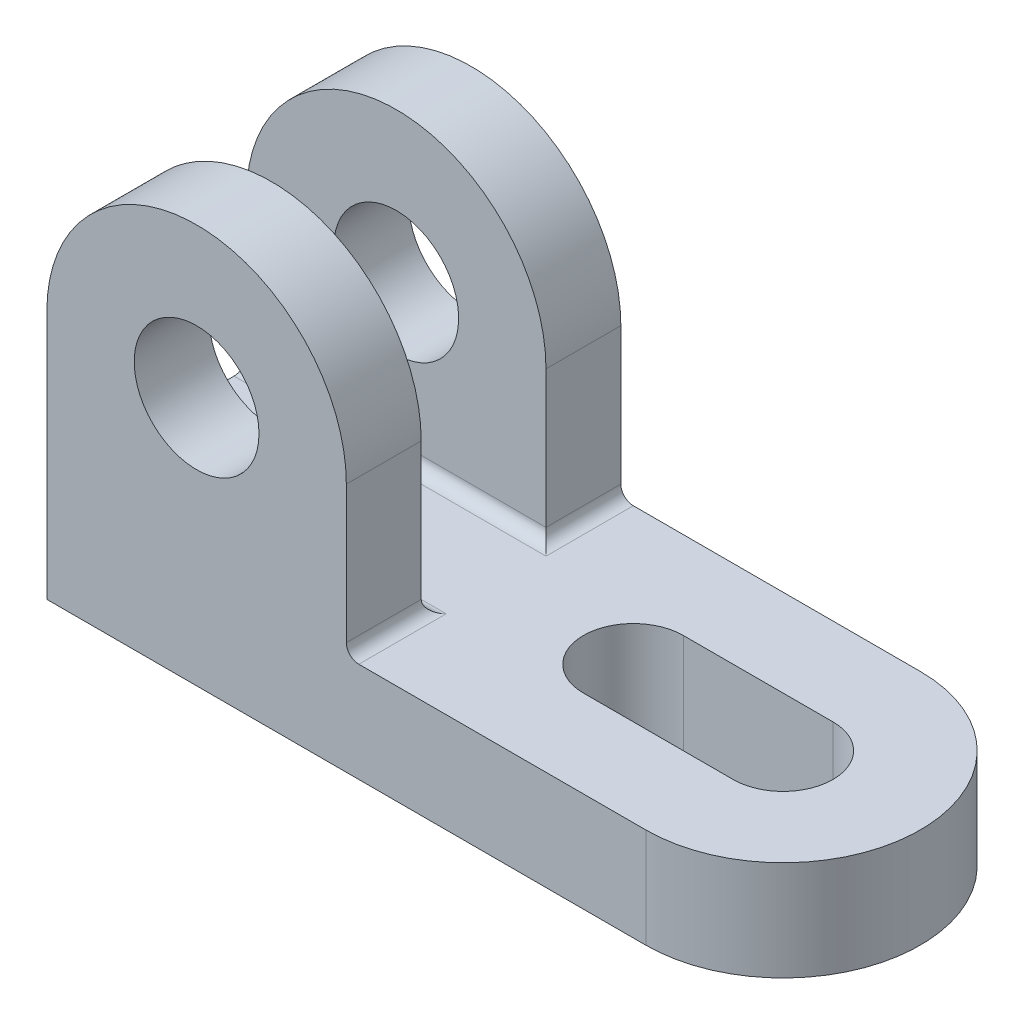
ISO-10303-21;
HEADER;
FILE_DESCRIPTION(('STEP AP214'),'2;1');
FILE_NAME('part.step','',(''),(''),'','','');
FILE_SCHEMA(('AUTOMOTIVE_DESIGN { 1 0 10303 214 1 1 1 1 }'));
ENDSEC;
DATA;
#1=APPLICATION_CONTEXT('core data for automotive mechanical design processes');
#2=APPLICATION_PROTOCOL_DEFINITION('international standard','automotive_design',2000,#1);
#3=PRODUCT_CONTEXT('',#1,'mechanical');
#4=PRODUCT('Part','Part','',(#3));
#5=PRODUCT_RELATED_PRODUCT_CATEGORY('part','',(#4));
#6=PRODUCT_DEFINITION_FORMATION('','',#4);
#7=PRODUCT_DEFINITION_CONTEXT('part definition',#1,'design');
#8=PRODUCT_DEFINITION('design','',#6,#7);
#9=PRODUCT_DEFINITION_SHAPE('','',#8);
#10=(LENGTH_UNIT() NAMED_UNIT(*) SI_UNIT(.MILLI.,.METRE.));
#11=(NAMED_UNIT(*) PLANE_ANGLE_UNIT() SI_UNIT($,.RADIAN.));
#12=(NAMED_UNIT(*) SI_UNIT($,.STERADIAN.) SOLID_ANGLE_UNIT());
#13=UNCERTAINTY_MEASURE_WITH_UNIT(LENGTH_MEASURE(1.E-05),#10,'distance_accuracy_value','');
#14=(GEOMETRIC_REPRESENTATION_CONTEXT(3) GLOBAL_UNCERTAINTY_ASSIGNED_CONTEXT((#13)) GLOBAL_UNIT_ASSIGNED_CONTEXT((#10,
#11,#12)) REPRESENTATION_CONTEXT('',''));
#15=CARTESIAN_POINT('',(0.,0.,0.));
#16=DIRECTION('',(0.,0.,1.));
#17=DIRECTION('',(1.,0.,0.));
#18=AXIS2_PLACEMENT_3D('',#15,#16,#17);
#19=CARTESIAN_POINT('',(0.,16.,0.));
#20=DIRECTION('',(0.,1.,0.));
#21=DIRECTION('',(0.,0.,1.));
#22=AXIS2_PLACEMENT_3D('',#19,#20,#21);
#23=PLANE('',#22);
#24=CARTESIAN_POINT('',(72.,16.,-22.));
#25=DIRECTION('',(0.,1.,0.));
#26=DIRECTION('',(0.,0.,1.));
#27=AXIS2_PLACEMENT_3D('',#24,#25,#26);
#28=CIRCLE('',#27,8.);
#29=CARTESIAN_POINT('',(72.,16.,-30.));
#30=VERTEX_POINT('',#29);
#31=CARTESIAN_POINT('',(72.,16.,-14.));
#32=VERTEX_POINT('',#31);
#33=EDGE_CURVE('E232',#30,#32,#28,.T.);
#34=ORIENTED_EDGE('',*,*,#33,.F.);
#35=DIRECTION('',(-1.,0.,0.));
#36=VECTOR('',#35,1.);
#37=CARTESIAN_POINT('',(72.,16.,-30.));
#38=LINE('',#37,#36);
#39=CARTESIAN_POINT('',(96.,16.,-30.));
#40=VERTEX_POINT('',#39);
#41=EDGE_CURVE('E244',#40,#30,#38,.T.);
#42=ORIENTED_EDGE('',*,*,#41,.F.);
#43=CARTESIAN_POINT('',(96.,16.,-22.));
#44=DIRECTION('',(0.,1.,0.));
#45=DIRECTION('',(0.,0.,1.));
#46=AXIS2_PLACEMENT_3D('',#43,#44,#45);
#47=CIRCLE('',#46,8.);
#48=CARTESIAN_POINT('',(96.,16.,-14.));
#49=VERTEX_POINT('',#48);
#50=EDGE_CURVE('E258',#49,#40,#47,.T.);
#51=ORIENTED_EDGE('',*,*,#50,.F.);
#52=DIRECTION('',(1.,0.,0.));
#53=VECTOR('',#52,1.);
#54=CARTESIAN_POINT('',(72.,16.,-14.));
#55=LINE('',#54,#53);
#56=EDGE_CURVE('E255',#32,#49,#55,.T.);
#57=ORIENTED_EDGE('',*,*,#56,.F.);
#58=EDGE_LOOP('',(#34,#42,#51,#57));
#59=FACE_BOUND('',#58,.T.);
#60=DIRECTION('',(-1.,0.,0.));
#61=VECTOR('',#60,1.);
#62=CARTESIAN_POINT('',(0.,16.,-44.));
#63=LINE('',#62,#61);
#64=CARTESIAN_POINT('',(96.,16.,-44.));
#65=VERTEX_POINT('',#64);
#66=CARTESIAN_POINT('',(50.,16.,-44.));
#67=VERTEX_POINT('',#66);
#68=EDGE_CURVE('E277',#65,#67,#63,.T.);
#69=ORIENTED_EDGE('',*,*,#68,.T.);
#70=DIRECTION('',(0.,0.,-1.));
#71=VECTOR('',#70,1.);
#72=CARTESIAN_POINT('',(50.,16.,0.));
#73=LINE('',#72,#71);
#74=CARTESIAN_POINT('',(50.,16.,-30.));
#75=VERTEX_POINT('',#74);
#76=EDGE_CURVE('E317',#67,#75,#73,.F.);
#77=ORIENTED_EDGE('',*,*,#76,.T.);
#78=DIRECTION('',(1.,0.,0.));
#79=VECTOR('',#78,1.);
#80=CARTESIAN_POINT('',(0.,16.,-30.));
#81=LINE('',#80,#79);
#82=CARTESIAN_POINT('',(0.,16.,-30.));
#83=VERTEX_POINT('',#82);
#84=EDGE_CURVE('E315',#75,#83,#81,.F.);
#85=ORIENTED_EDGE('',*,*,#84,.T.);
#86=DIRECTION('',(0.,0.,1.));
#87=VECTOR('',#86,1.);
#88=CARTESIAN_POINT('',(0.,16.,0.));
#89=LINE('',#88,#87);
#90=CARTESIAN_POINT('',(0.,16.,-14.));
#91=VERTEX_POINT('',#90);
#92=EDGE_CURVE('E280',#83,#91,#89,.T.);
#93=ORIENTED_EDGE('',*,*,#92,.T.);
#94=DIRECTION('',(1.,0.,0.));
#95=VECTOR('',#94,1.);
#96=CARTESIAN_POINT('',(0.,16.,-14.));
#97=LINE('',#96,#95);
#98=CARTESIAN_POINT('',(50.,16.,-14.));
#99=VERTEX_POINT('',#98);
#100=EDGE_CURVE('E312',#91,#99,#97,.T.);
#101=ORIENTED_EDGE('',*,*,#100,.T.);
#102=DIRECTION('',(0.,0.,1.));
#103=VECTOR('',#102,1.);
#104=CARTESIAN_POINT('',(50.,16.,0.));
#105=LINE('',#104,#103);
#106=CARTESIAN_POINT('',(50.,16.,0.));
#107=VERTEX_POINT('',#106);
#108=EDGE_CURVE('E310',#99,#107,#105,.T.);
#109=ORIENTED_EDGE('',*,*,#108,.T.);
#110=DIRECTION('',(1.,0.,0.));
#111=VECTOR('',#110,1.);
#112=CARTESIAN_POINT('',(0.,16.,0.));
#113=LINE('',#112,#111);
#114=CARTESIAN_POINT('',(96.,16.,0.));
#115=VERTEX_POINT('',#114);
#116=EDGE_CURVE('E272',#107,#115,#113,.T.);
#117=ORIENTED_EDGE('',*,*,#116,.T.);
#118=CARTESIAN_POINT('',(96.,16.,-22.));
#119=DIRECTION('',(0.,1.,0.));
#120=DIRECTION('',(0.,0.,1.));
#121=AXIS2_PLACEMENT_3D('',#118,#119,#120);
#122=CIRCLE('',#121,22.);
#123=EDGE_CURVE('E274',#115,#65,#122,.T.);
#124=ORIENTED_EDGE('',*,*,#123,.T.);
#125=EDGE_LOOP('',(#69,#77,#85,#93,#101,#109,#117,#124));
#126=FACE_BOUND('',#125,.T.);
#127=ADVANCED_FACE('F65',(#59,#126),#23,.T.);
#128=CARTESIAN_POINT('',(0.,16.,0.));
#129=DIRECTION('',(0.,0.,-1.));
#130=DIRECTION('',(-1.,0.,0.));
#131=AXIS2_PLACEMENT_3D('',#128,#129,#130);
#132=PLANE('',#131);
#133=CARTESIAN_POINT('',(24.,40.,0.));
#134=DIRECTION('',(0.,0.,1.));
#135=DIRECTION('',(1.,0.,0.));
#136=AXIS2_PLACEMENT_3D('',#133,#134,#135);
#137=CIRCLE('',#136,10.);
#138=CARTESIAN_POINT('',(34.,40.,0.));
#139=VERTEX_POINT('',#138);
#140=EDGE_CURVE('E213',#139,#139,#137,.T.);
#141=ORIENTED_EDGE('',*,*,#140,.F.);
#142=EDGE_LOOP('',(#141));
#143=FACE_BOUND('',#142,.T.);
#144=DIRECTION('',(1.,0.,0.));
#145=VECTOR('',#144,1.);
#146=CARTESIAN_POINT('',(0.,0.,0.));
#147=LINE('',#146,#145);
#148=CARTESIAN_POINT('',(0.,0.,0.));
#149=VERTEX_POINT('',#148);
#150=CARTESIAN_POINT('',(96.,0.,0.));
#151=VERTEX_POINT('',#150);
#152=EDGE_CURVE('E265',#149,#151,#147,.T.);
#153=ORIENTED_EDGE('',*,*,#152,.T.);
#154=DIRECTION('',(0.,-1.,0.));
#155=VECTOR('',#154,1.);
#156=CARTESIAN_POINT('',(96.,16.,0.));
#157=LINE('',#156,#155);
#158=EDGE_CURVE('E299',#115,#151,#157,.T.);
#159=ORIENTED_EDGE('',*,*,#158,.F.);
#160=ORIENTED_EDGE('',*,*,#116,.F.);
#161=CARTESIAN_POINT('',(50.,18.,0.));
#162=DIRECTION('',(0.,0.,-1.));
#163=DIRECTION('',(-1.,0.,0.));
#164=AXIS2_PLACEMENT_3D('',#161,#162,#163);
#165=CIRCLE('',#164,2.);
#166=CARTESIAN_POINT('',(48.,18.,0.));
#167=VERTEX_POINT('',#166);
#168=EDGE_CURVE('E12',#107,#167,#165,.T.);
#169=ORIENTED_EDGE('',*,*,#168,.T.);
#170=DIRECTION('',(0.,1.,0.));
#171=VECTOR('',#170,1.);
#172=CARTESIAN_POINT('',(48.,16.,0.));
#173=LINE('',#172,#171);
#174=CARTESIAN_POINT('',(48.,40.,0.));
#175=VERTEX_POINT('',#174);
#176=EDGE_CURVE('E224',#167,#175,#173,.T.);
#177=ORIENTED_EDGE('',*,*,#176,.T.);
#178=CARTESIAN_POINT('',(24.,40.,0.));
#179=DIRECTION('',(0.,0.,1.));
#180=DIRECTION('',(1.,0.,0.));
#181=AXIS2_PLACEMENT_3D('',#178,#179,#180);
#182=CIRCLE('',#181,24.);
#183=CARTESIAN_POINT('',(0.,40.,0.));
#184=VERTEX_POINT('',#183);
#185=EDGE_CURVE('E237',#175,#184,#182,.T.);
#186=ORIENTED_EDGE('',*,*,#185,.T.);
#187=DIRECTION('',(0.,-1.,0.));
#188=VECTOR('',#187,1.);
#189=CARTESIAN_POINT('',(0.,16.,0.));
#190=LINE('',#189,#188);
#191=EDGE_CURVE('E283',#184,#149,#190,.T.);
#192=ORIENTED_EDGE('',*,*,#191,.T.);
#193=EDGE_LOOP('',(#153,#159,#160,#169,#177,#186,#192));
#194=FACE_BOUND('',#193,.T.);
#195=ADVANCED_FACE('F362',(#143,#194),#132,.F.);
#196=CARTESIAN_POINT('',(96.,16.,-22.));
#197=DIRECTION('',(0.,-1.,0.));
#198=DIRECTION('',(0.,0.,-1.));
#199=AXIS2_PLACEMENT_3D('',#196,#197,#198);
#200=CYLINDRICAL_SURFACE('',#199,22.);
#201=CARTESIAN_POINT('',(96.,0.,-22.));
#202=DIRECTION('',(0.,1.,0.));
#203=DIRECTION('',(0.,0.,1.));
#204=AXIS2_PLACEMENT_3D('',#201,#202,#203);
#205=CIRCLE('',#204,22.);
#206=CARTESIAN_POINT('',(96.,0.,-44.));
#207=VERTEX_POINT('',#206);
#208=EDGE_CURVE('E286',#151,#207,#205,.T.);
#209=ORIENTED_EDGE('',*,*,#208,.T.);
#210=DIRECTION('',(0.,-1.,0.));
#211=VECTOR('',#210,1.);
#212=CARTESIAN_POINT('',(96.,16.,-44.));
#213=LINE('',#212,#211);
#214=EDGE_CURVE('E296',#65,#207,#213,.T.);
#215=ORIENTED_EDGE('',*,*,#214,.F.);
#216=ORIENTED_EDGE('',*,*,#123,.F.);
#217=ORIENTED_EDGE('',*,*,#158,.T.);
#218=EDGE_LOOP('',(#209,#215,#216,#217));
#219=FACE_BOUND('',#218,.T.);
#220=ADVANCED_FACE('F391',(#219),#200,.T.);
#221=CARTESIAN_POINT('',(0.,16.,-44.));
#222=DIRECTION('',(0.,0.,1.));
#223=DIRECTION('',(1.,0.,0.));
#224=AXIS2_PLACEMENT_3D('',#221,#222,#223);
#225=PLANE('',#224);
#226=CARTESIAN_POINT('',(24.,40.,-44.));
#227=DIRECTION('',(0.,0.,1.));
#228=DIRECTION('',(1.,0.,0.));
#229=AXIS2_PLACEMENT_3D('',#226,#227,#228);
#230=CIRCLE('',#229,10.);
#231=CARTESIAN_POINT('',(34.,40.,-44.));
#232=VERTEX_POINT('',#231);
#233=EDGE_CURVE('E308',#232,#232,#230,.T.);
#234=ORIENTED_EDGE('',*,*,#233,.T.);
#235=EDGE_LOOP('',(#234));
#236=FACE_BOUND('',#235,.T.);
#237=DIRECTION('',(-1.,0.,0.));
#238=VECTOR('',#237,1.);
#239=CARTESIAN_POINT('',(0.,0.,-44.));
#240=LINE('',#239,#238);
#241=CARTESIAN_POINT('',(0.,0.,-44.));
#242=VERTEX_POINT('',#241);
#243=EDGE_CURVE('E288',#207,#242,#240,.T.);
#244=ORIENTED_EDGE('',*,*,#243,.T.);
#245=DIRECTION('',(0.,-1.,0.));
#246=VECTOR('',#245,1.);
#247=CARTESIAN_POINT('',(0.,16.,-44.));
#248=LINE('',#247,#246);
#249=CARTESIAN_POINT('',(0.,40.,-44.));
#250=VERTEX_POINT('',#249);
#251=EDGE_CURVE('E293',#250,#242,#248,.T.);
#252=ORIENTED_EDGE('',*,*,#251,.F.);
#253=CARTESIAN_POINT('',(24.,40.,-44.));
#254=DIRECTION('',(0.,0.,1.));
#255=DIRECTION('',(1.,0.,0.));
#256=AXIS2_PLACEMENT_3D('',#253,#254,#255);
#257=CIRCLE('',#256,24.);
#258=CARTESIAN_POINT('',(48.,40.,-44.));
#259=VERTEX_POINT('',#258);
#260=EDGE_CURVE('E209',#259,#250,#257,.T.);
#261=ORIENTED_EDGE('',*,*,#260,.F.);
#262=DIRECTION('',(0.,1.,0.));
#263=VECTOR('',#262,1.);
#264=CARTESIAN_POINT('',(48.,16.,-44.));
#265=LINE('',#264,#263);
#266=CARTESIAN_POINT('',(48.,18.,-44.));
#267=VERTEX_POINT('',#266);
#268=EDGE_CURVE('E208',#267,#259,#265,.T.);
#269=ORIENTED_EDGE('',*,*,#268,.F.);
#270=CARTESIAN_POINT('',(50.,18.,-44.));
#271=DIRECTION('',(0.,0.,1.));
#272=DIRECTION('',(1.,0.,0.));
#273=AXIS2_PLACEMENT_3D('',#270,#271,#272);
#274=CIRCLE('',#273,2.);
#275=EDGE_CURVE('E323',#267,#67,#274,.T.);
#276=ORIENTED_EDGE('',*,*,#275,.T.);
#277=ORIENTED_EDGE('',*,*,#68,.F.);
#278=ORIENTED_EDGE('',*,*,#214,.T.);
#279=EDGE_LOOP('',(#244,#252,#261,#269,#276,#277,#278));
#280=FACE_BOUND('',#279,.T.);
#281=ADVANCED_FACE('F352',(#236,#280),#225,.F.);
#282=CARTESIAN_POINT('',(0.,16.,0.));
#283=DIRECTION('',(1.,0.,0.));
#284=DIRECTION('',(0.,0.,-1.));
#285=AXIS2_PLACEMENT_3D('',#282,#283,#284);
#286=PLANE('',#285);
#287=DIRECTION('',(0.,0.,1.));
#288=VECTOR('',#287,1.);
#289=CARTESIAN_POINT('',(0.,0.,0.));
#290=LINE('',#289,#288);
#291=EDGE_CURVE('E275',#242,#149,#290,.T.);
#292=ORIENTED_EDGE('',*,*,#291,.T.);
#293=ORIENTED_EDGE('',*,*,#191,.F.);
#294=DIRECTION('',(0.,0.,1.));
#295=VECTOR('',#294,1.);
#296=CARTESIAN_POINT('',(0.,40.,-12.));
#297=LINE('',#296,#295);
#298=CARTESIAN_POINT('',(0.,40.,-12.));
#299=VERTEX_POINT('',#298);
#300=EDGE_CURVE('E229',#299,#184,#297,.T.);
#301=ORIENTED_EDGE('',*,*,#300,.F.);
#302=DIRECTION('',(0.,1.,0.));
#303=VECTOR('',#302,1.);
#304=CARTESIAN_POINT('',(0.,16.,-12.));
#305=LINE('',#304,#303);
#306=CARTESIAN_POINT('',(0.,18.,-12.));
#307=VERTEX_POINT('',#306);
#308=EDGE_CURVE('E223',#307,#299,#305,.T.);
#309=ORIENTED_EDGE('',*,*,#308,.F.);
#310=CARTESIAN_POINT('',(0.,18.,-14.));
#311=DIRECTION('',(1.,0.,0.));
#312=DIRECTION('',(0.,0.,-1.));
#313=AXIS2_PLACEMENT_3D('',#310,#311,#312);
#314=CIRCLE('',#313,2.);
#315=EDGE_CURVE('E74',#307,#91,#314,.T.);
#316=ORIENTED_EDGE('',*,*,#315,.T.);
#317=ORIENTED_EDGE('',*,*,#92,.F.);
#318=CARTESIAN_POINT('',(0.,18.,-30.));
#319=DIRECTION('',(1.,0.,0.));
#320=DIRECTION('',(0.,0.,-1.));
#321=AXIS2_PLACEMENT_3D('',#318,#319,#320);
#322=CIRCLE('',#321,2.);
#323=CARTESIAN_POINT('',(0.,18.,-32.));
#324=VERTEX_POINT('',#323);
#325=EDGE_CURVE('E325',#83,#324,#322,.T.);
#326=ORIENTED_EDGE('',*,*,#325,.T.);
#327=DIRECTION('',(0.,1.,0.));
#328=VECTOR('',#327,1.);
#329=CARTESIAN_POINT('',(0.,16.,-32.));
#330=LINE('',#329,#328);
#331=CARTESIAN_POINT('',(0.,40.,-32.));
#332=VERTEX_POINT('',#331);
#333=EDGE_CURVE('E198',#324,#332,#330,.T.);
#334=ORIENTED_EDGE('',*,*,#333,.T.);
#335=DIRECTION('',(0.,0.,-1.));
#336=VECTOR('',#335,1.);
#337=CARTESIAN_POINT('',(0.,40.,-32.));
#338=LINE('',#337,#336);
#339=EDGE_CURVE('E197',#332,#250,#338,.T.);
#340=ORIENTED_EDGE('',*,*,#339,.T.);
#341=ORIENTED_EDGE('',*,*,#251,.T.);
#342=EDGE_LOOP('',(#292,#293,#301,#309,#316,#317,#326,#334,#340,#341));
#343=FACE_BOUND('',#342,.T.);
#344=ADVANCED_FACE('F347',(#343),#286,.F.);
#345=CARTESIAN_POINT('',(0.,0.,0.));
#346=DIRECTION('',(0.,1.,0.));
#347=DIRECTION('',(0.,0.,1.));
#348=AXIS2_PLACEMENT_3D('',#345,#346,#347);
#349=PLANE('',#348);
#350=DIRECTION('',(-1.,0.,0.));
#351=VECTOR('',#350,1.);
#352=CARTESIAN_POINT('',(72.,0.,-30.));
#353=LINE('',#352,#351);
#354=CARTESIAN_POINT('',(96.,0.,-30.));
#355=VERTEX_POINT('',#354);
#356=CARTESIAN_POINT('',(72.,0.,-30.));
#357=VERTEX_POINT('',#356);
#358=EDGE_CURVE('E250',#355,#357,#353,.T.);
#359=ORIENTED_EDGE('',*,*,#358,.T.);
#360=CARTESIAN_POINT('',(72.,0.,-22.));
#361=DIRECTION('',(0.,1.,0.));
#362=DIRECTION('',(0.,0.,1.));
#363=AXIS2_PLACEMENT_3D('',#360,#361,#362);
#364=CIRCLE('',#363,8.);
#365=CARTESIAN_POINT('',(72.,0.,-14.));
#366=VERTEX_POINT('',#365);
#367=EDGE_CURVE('E240',#357,#366,#364,.T.);
#368=ORIENTED_EDGE('',*,*,#367,.T.);
#369=DIRECTION('',(1.,0.,0.));
#370=VECTOR('',#369,1.);
#371=CARTESIAN_POINT('',(72.,0.,-14.));
#372=LINE('',#371,#370);
#373=CARTESIAN_POINT('',(96.,0.,-14.));
#374=VERTEX_POINT('',#373);
#375=EDGE_CURVE('E243',#366,#374,#372,.T.);
#376=ORIENTED_EDGE('',*,*,#375,.T.);
#377=CARTESIAN_POINT('',(96.,0.,-22.));
#378=DIRECTION('',(0.,1.,0.));
#379=DIRECTION('',(0.,0.,1.));
#380=AXIS2_PLACEMENT_3D('',#377,#378,#379);
#381=CIRCLE('',#380,8.);
#382=EDGE_CURVE('E247',#374,#355,#381,.T.);
#383=ORIENTED_EDGE('',*,*,#382,.T.);
#384=EDGE_LOOP('',(#359,#368,#376,#383));
#385=FACE_BOUND('',#384,.T.);
#386=ORIENTED_EDGE('',*,*,#152,.F.);
#387=ORIENTED_EDGE('',*,*,#291,.F.);
#388=ORIENTED_EDGE('',*,*,#243,.F.);
#389=ORIENTED_EDGE('',*,*,#208,.F.);
#390=EDGE_LOOP('',(#386,#387,#388,#389));
#391=FACE_BOUND('',#390,.T.);
#392=ADVANCED_FACE('F360',(#385,#391),#349,.F.);
#393=CARTESIAN_POINT('',(72.,0.,-22.));
#394=DIRECTION('',(0.,1.,0.));
#395=DIRECTION('',(0.,0.,1.));
#396=AXIS2_PLACEMENT_3D('',#393,#394,#395);
#397=CYLINDRICAL_SURFACE('',#396,8.);
#398=ORIENTED_EDGE('',*,*,#33,.T.);
#399=DIRECTION('',(0.,1.,0.));
#400=VECTOR('',#399,1.);
#401=CARTESIAN_POINT('',(72.,0.,-14.));
#402=LINE('',#401,#400);
#403=EDGE_CURVE('E253',#366,#32,#402,.T.);
#404=ORIENTED_EDGE('',*,*,#403,.F.);
#405=ORIENTED_EDGE('',*,*,#367,.F.);
#406=DIRECTION('',(0.,1.,0.));
#407=VECTOR('',#406,1.);
#408=CARTESIAN_POINT('',(72.,0.,-30.));
#409=LINE('',#408,#407);
#410=EDGE_CURVE('E263',#357,#30,#409,.T.);
#411=ORIENTED_EDGE('',*,*,#410,.T.);
#412=EDGE_LOOP('',(#398,#404,#405,#411));
#413=FACE_BOUND('',#412,.T.);
#414=ADVANCED_FACE('F397',(#413),#397,.F.);
#415=CARTESIAN_POINT('',(72.,0.,-30.));
#416=DIRECTION('',(0.,0.,-1.));
#417=DIRECTION('',(-1.,0.,0.));
#418=AXIS2_PLACEMENT_3D('',#415,#416,#417);
#419=PLANE('',#418);
#420=ORIENTED_EDGE('',*,*,#41,.T.);
#421=ORIENTED_EDGE('',*,*,#410,.F.);
#422=ORIENTED_EDGE('',*,*,#358,.F.);
#423=DIRECTION('',(0.,1.,0.));
#424=VECTOR('',#423,1.);
#425=CARTESIAN_POINT('',(96.,0.,-30.));
#426=LINE('',#425,#424);
#427=EDGE_CURVE('E266',#355,#40,#426,.T.);
#428=ORIENTED_EDGE('',*,*,#427,.T.);
#429=EDGE_LOOP('',(#420,#421,#422,#428));
#430=FACE_BOUND('',#429,.T.);
#431=ADVANCED_FACE('F531',(#430),#419,.F.);
#432=CARTESIAN_POINT('',(96.,0.,-22.));
#433=DIRECTION('',(0.,1.,0.));
#434=DIRECTION('',(0.,0.,1.));
#435=AXIS2_PLACEMENT_3D('',#432,#433,#434);
#436=CYLINDRICAL_SURFACE('',#435,8.);
#437=ORIENTED_EDGE('',*,*,#50,.T.);
#438=ORIENTED_EDGE('',*,*,#427,.F.);
#439=ORIENTED_EDGE('',*,*,#382,.F.);
#440=DIRECTION('',(0.,1.,0.));
#441=VECTOR('',#440,1.);
#442=CARTESIAN_POINT('',(96.,0.,-14.));
#443=LINE('',#442,#441);
#444=EDGE_CURVE('E268',#374,#49,#443,.T.);
#445=ORIENTED_EDGE('',*,*,#444,.T.);
#446=EDGE_LOOP('',(#437,#438,#439,#445));
#447=FACE_BOUND('',#446,.T.);
#448=ADVANCED_FACE('F381',(#447),#436,.F.);
#449=CARTESIAN_POINT('',(72.,0.,-14.));
#450=DIRECTION('',(0.,0.,1.));
#451=DIRECTION('',(1.,0.,0.));
#452=AXIS2_PLACEMENT_3D('',#449,#450,#451);
#453=PLANE('',#452);
#454=ORIENTED_EDGE('',*,*,#56,.T.);
#455=ORIENTED_EDGE('',*,*,#444,.F.);
#456=ORIENTED_EDGE('',*,*,#375,.F.);
#457=ORIENTED_EDGE('',*,*,#403,.T.);
#458=EDGE_LOOP('',(#454,#455,#456,#457));
#459=FACE_BOUND('',#458,.T.);
#460=ADVANCED_FACE('F373',(#459),#453,.F.);
#461=CARTESIAN_POINT('',(48.,16.,-12.));
#462=DIRECTION('',(1.,0.,0.));
#463=DIRECTION('',(0.,1.,0.));
#464=AXIS2_PLACEMENT_3D('',#461,#462,#463);
#465=PLANE('',#464);
#466=ORIENTED_EDGE('',*,*,#176,.F.);
#467=DIRECTION('',(0.,0.,1.));
#468=VECTOR('',#467,1.);
#469=CARTESIAN_POINT('',(48.,18.,-12.));
#470=LINE('',#469,#468);
#471=CARTESIAN_POINT('',(48.,18.,-12.));
#472=VERTEX_POINT('',#471);
#473=EDGE_CURVE('E321',#167,#472,#470,.F.);
#474=ORIENTED_EDGE('',*,*,#473,.T.);
#475=DIRECTION('',(0.,1.,0.));
#476=VECTOR('',#475,1.);
#477=CARTESIAN_POINT('',(48.,16.,-12.));
#478=LINE('',#477,#476);
#479=CARTESIAN_POINT('',(48.,40.,-12.));
#480=VERTEX_POINT('',#479);
#481=EDGE_CURVE('E221',#472,#480,#478,.T.);
#482=ORIENTED_EDGE('',*,*,#481,.T.);
#483=DIRECTION('',(0.,0.,1.));
#484=VECTOR('',#483,1.);
#485=CARTESIAN_POINT('',(48.,40.,-12.));
#486=LINE('',#485,#484);
#487=EDGE_CURVE('E226',#480,#175,#486,.T.);
#488=ORIENTED_EDGE('',*,*,#487,.T.);
#489=EDGE_LOOP('',(#466,#474,#482,#488));
#490=FACE_BOUND('',#489,.T.);
#491=ADVANCED_FACE('F371',(#490),#465,.T.);
#492=CARTESIAN_POINT('',(0.,0.,-12.));
#493=DIRECTION('',(0.,0.,1.));
#494=DIRECTION('',(1.,0.,0.));
#495=AXIS2_PLACEMENT_3D('',#492,#493,#494);
#496=PLANE('',#495);
#497=CARTESIAN_POINT('',(24.,40.,-12.));
#498=DIRECTION('',(0.,0.,1.));
#499=DIRECTION('',(1.,0.,0.));
#500=AXIS2_PLACEMENT_3D('',#497,#498,#499);
#501=CIRCLE('',#500,10.);
#502=CARTESIAN_POINT('',(34.,40.,-12.));
#503=VERTEX_POINT('',#502);
#504=EDGE_CURVE('E216',#503,#503,#501,.T.);
#505=ORIENTED_EDGE('',*,*,#504,.T.);
#506=EDGE_LOOP('',(#505));
#507=FACE_BOUND('',#506,.T.);
#508=ORIENTED_EDGE('',*,*,#481,.F.);
#509=DIRECTION('',(1.,0.,0.));
#510=VECTOR('',#509,1.);
#511=CARTESIAN_POINT('',(0.,18.,-12.));
#512=LINE('',#511,#510);
#513=EDGE_CURVE('E88',#472,#307,#512,.F.);
#514=ORIENTED_EDGE('',*,*,#513,.T.);
#515=ORIENTED_EDGE('',*,*,#308,.T.);
#516=CARTESIAN_POINT('',(24.,40.,-12.));
#517=DIRECTION('',(0.,0.,1.));
#518=DIRECTION('',(1.,0.,0.));
#519=AXIS2_PLACEMENT_3D('',#516,#517,#518);
#520=CIRCLE('',#519,24.);
#521=EDGE_CURVE('E228',#480,#299,#520,.T.);
#522=ORIENTED_EDGE('',*,*,#521,.F.);
#523=EDGE_LOOP('',(#508,#514,#515,#522));
#524=FACE_BOUND('',#523,.T.);
#525=ADVANCED_FACE('F369',(#507,#524),#496,.F.);
#526=CARTESIAN_POINT('',(24.,40.,-12.));
#527=DIRECTION('',(0.,0.,1.));
#528=DIRECTION('',(1.,0.,0.));
#529=AXIS2_PLACEMENT_3D('',#526,#527,#528);
#530=CYLINDRICAL_SURFACE('',#529,24.);
#531=ORIENTED_EDGE('',*,*,#300,.T.);
#532=ORIENTED_EDGE('',*,*,#185,.F.);
#533=ORIENTED_EDGE('',*,*,#487,.F.);
#534=ORIENTED_EDGE('',*,*,#521,.T.);
#535=EDGE_LOOP('',(#531,#532,#533,#534));
#536=FACE_BOUND('',#535,.T.);
#537=ADVANCED_FACE('F366',(#536),#530,.T.);
#538=CARTESIAN_POINT('',(24.,40.,-44.));
#539=DIRECTION('',(0.,0.,1.));
#540=DIRECTION('',(1.,0.,0.));
#541=AXIS2_PLACEMENT_3D('',#538,#539,#540);
#542=CYLINDRICAL_SURFACE('',#541,10.);
#543=ORIENTED_EDGE('',*,*,#140,.T.);
#544=EDGE_LOOP('',(#543));
#545=FACE_BOUND('',#544,.T.);
#546=ORIENTED_EDGE('',*,*,#504,.F.);
#547=EDGE_LOOP('',(#546));
#548=FACE_BOUND('',#547,.T.);
#549=ADVANCED_FACE('F454',(#545,#548),#542,.F.);
#550=CARTESIAN_POINT('',(48.,16.,-32.));
#551=DIRECTION('',(-1.,0.,0.));
#552=DIRECTION('',(0.,-1.,0.));
#553=AXIS2_PLACEMENT_3D('',#550,#551,#552);
#554=PLANE('',#553);
#555=DIRECTION('',(0.,1.,0.));
#556=VECTOR('',#555,1.);
#557=CARTESIAN_POINT('',(48.,16.,-32.));
#558=LINE('',#557,#556);
#559=CARTESIAN_POINT('',(48.,18.,-32.));
#560=VERTEX_POINT('',#559);
#561=CARTESIAN_POINT('',(48.,40.,-32.));
#562=VERTEX_POINT('',#561);
#563=EDGE_CURVE('E186',#560,#562,#558,.T.);
#564=ORIENTED_EDGE('',*,*,#563,.F.);
#565=DIRECTION('',(0.,0.,-1.));
#566=VECTOR('',#565,1.);
#567=CARTESIAN_POINT('',(48.,18.,-32.));
#568=LINE('',#567,#566);
#569=EDGE_CURVE('E302',#560,#267,#568,.T.);
#570=ORIENTED_EDGE('',*,*,#569,.T.);
#571=ORIENTED_EDGE('',*,*,#268,.T.);
#572=DIRECTION('',(0.,0.,-1.));
#573=VECTOR('',#572,1.);
#574=CARTESIAN_POINT('',(48.,40.,-32.));
#575=LINE('',#574,#573);
#576=EDGE_CURVE('E205',#562,#259,#575,.T.);
#577=ORIENTED_EDGE('',*,*,#576,.F.);
#578=EDGE_LOOP('',(#564,#570,#571,#577));
#579=FACE_BOUND('',#578,.T.);
#580=ADVANCED_FACE('F211',(#579),#554,.F.);
#581=CARTESIAN_POINT('',(0.,0.,-32.));
#582=DIRECTION('',(0.,0.,-1.));
#583=DIRECTION('',(1.,0.,0.));
#584=AXIS2_PLACEMENT_3D('',#581,#582,#583);
#585=PLANE('',#584);
#586=CARTESIAN_POINT('',(24.,40.,-32.));
#587=DIRECTION('',(0.,0.,-1.));
#588=DIRECTION('',(-1.,0.,0.));
#589=AXIS2_PLACEMENT_3D('',#586,#587,#588);
#590=CIRCLE('',#589,10.);
#591=CARTESIAN_POINT('',(14.,40.,-32.));
#592=VERTEX_POINT('',#591);
#593=EDGE_CURVE('E305',#592,#592,#590,.F.);
#594=ORIENTED_EDGE('',*,*,#593,.F.);
#595=EDGE_LOOP('',(#594));
#596=FACE_BOUND('',#595,.T.);
#597=ORIENTED_EDGE('',*,*,#333,.F.);
#598=DIRECTION('',(1.,0.,0.));
#599=VECTOR('',#598,1.);
#600=CARTESIAN_POINT('',(0.,18.,-32.));
#601=LINE('',#600,#599);
#602=EDGE_CURVE('E192',#324,#560,#601,.T.);
#603=ORIENTED_EDGE('',*,*,#602,.T.);
#604=ORIENTED_EDGE('',*,*,#563,.T.);
#605=CARTESIAN_POINT('',(24.,40.,-32.));
#606=DIRECTION('',(0.,0.,1.));
#607=DIRECTION('',(1.,0.,0.));
#608=AXIS2_PLACEMENT_3D('',#605,#606,#607);
#609=CIRCLE('',#608,24.);
#610=EDGE_CURVE('E190',#562,#332,#609,.T.);
#611=ORIENTED_EDGE('',*,*,#610,.T.);
#612=EDGE_LOOP('',(#597,#603,#604,#611));
#613=FACE_BOUND('',#612,.T.);
#614=ADVANCED_FACE('F189',(#596,#613),#585,.F.);
#615=CARTESIAN_POINT('',(24.,40.,-32.));
#616=DIRECTION('',(0.,0.,-1.));
#617=DIRECTION('',(-1.,0.,0.));
#618=AXIS2_PLACEMENT_3D('',#615,#616,#617);
#619=CYLINDRICAL_SURFACE('',#618,24.);
#620=ORIENTED_EDGE('',*,*,#576,.T.);
#621=ORIENTED_EDGE('',*,*,#260,.T.);
#622=ORIENTED_EDGE('',*,*,#339,.F.);
#623=ORIENTED_EDGE('',*,*,#610,.F.);
#624=EDGE_LOOP('',(#620,#621,#622,#623));
#625=FACE_BOUND('',#624,.T.);
#626=ADVANCED_FACE('F203',(#625),#619,.T.);
#627=CARTESIAN_POINT('',(24.,40.,0.));
#628=DIRECTION('',(0.,0.,-1.));
#629=DIRECTION('',(-1.,0.,0.));
#630=AXIS2_PLACEMENT_3D('',#627,#628,#629);
#631=CYLINDRICAL_SURFACE('',#630,10.);
#632=ORIENTED_EDGE('',*,*,#233,.F.);
#633=EDGE_LOOP('',(#632));
#634=FACE_BOUND('',#633,.T.);
#635=ORIENTED_EDGE('',*,*,#593,.T.);
#636=EDGE_LOOP('',(#635));
#637=FACE_BOUND('',#636,.T.);
#638=ADVANCED_FACE('F412',(#634,#637),#631,.F.);
#639=CARTESIAN_POINT('',(0.,18.,-30.));
#640=DIRECTION('',(1.,0.,0.));
#641=DIRECTION('',(0.,0.,-1.));
#642=AXIS2_PLACEMENT_3D('',#639,#640,#641);
#643=CYLINDRICAL_SURFACE('',#642,2.);
#644=ORIENTED_EDGE('',*,*,#325,.F.);
#645=ORIENTED_EDGE('',*,*,#84,.F.);
#646=CARTESIAN_POINT('',(50.,18.,-30.));
#647=DIRECTION('',(0.707106781186547,0.,-0.707106781186547));
#648=DIRECTION('',(0.707106781186547,0.,0.707106781186547));
#649=AXIS2_PLACEMENT_3D('',#646,#647,#648);
#650=ELLIPSE('',#649,2.82842712474619,2.);
#651=EDGE_CURVE('E327',#560,#75,#650,.F.);
#652=ORIENTED_EDGE('',*,*,#651,.F.);
#653=ORIENTED_EDGE('',*,*,#602,.F.);
#654=EDGE_LOOP('',(#644,#645,#652,#653));
#655=FACE_BOUND('',#654,.T.);
#656=ADVANCED_FACE('F349',(#655),#643,.F.);
#657=CARTESIAN_POINT('',(50.,18.,-32.));
#658=DIRECTION('',(0.,0.,-1.));
#659=DIRECTION('',(-1.,0.,0.));
#660=AXIS2_PLACEMENT_3D('',#657,#658,#659);
#661=CYLINDRICAL_SURFACE('',#660,2.);
#662=ORIENTED_EDGE('',*,*,#651,.T.);
#663=ORIENTED_EDGE('',*,*,#76,.F.);
#664=ORIENTED_EDGE('',*,*,#275,.F.);
#665=ORIENTED_EDGE('',*,*,#569,.F.);
#666=EDGE_LOOP('',(#662,#663,#664,#665));
#667=FACE_BOUND('',#666,.T.);
#668=ADVANCED_FACE('F350',(#667),#661,.F.);
#669=CARTESIAN_POINT('',(50.,18.,0.));
#670=DIRECTION('',(0.,0.,-1.));
#671=DIRECTION('',(-1.,0.,0.));
#672=AXIS2_PLACEMENT_3D('',#669,#670,#671);
#673=CYLINDRICAL_SURFACE('',#672,2.);
#674=ORIENTED_EDGE('',*,*,#168,.F.);
#675=ORIENTED_EDGE('',*,*,#108,.F.);
#676=CARTESIAN_POINT('',(50.,18.,-14.));
#677=DIRECTION('',(-0.707106781186547,0.,-0.707106781186547));
#678=DIRECTION('',(0.707106781186547,0.,-0.707106781186547));
#679=AXIS2_PLACEMENT_3D('',#676,#677,#678);
#680=ELLIPSE('',#679,2.82842712474619,2.);
#681=EDGE_CURVE('E69',#472,#99,#680,.F.);
#682=ORIENTED_EDGE('',*,*,#681,.F.);
#683=ORIENTED_EDGE('',*,*,#473,.F.);
#684=EDGE_LOOP('',(#674,#675,#682,#683));
#685=FACE_BOUND('',#684,.T.);
#686=ADVANCED_FACE('F67',(#685),#673,.F.);
#687=CARTESIAN_POINT('',(0.,18.,-14.));
#688=DIRECTION('',(1.,0.,0.));
#689=DIRECTION('',(0.,0.,-1.));
#690=AXIS2_PLACEMENT_3D('',#687,#688,#689);
#691=CYLINDRICAL_SURFACE('',#690,2.);
#692=ORIENTED_EDGE('',*,*,#315,.F.);
#693=ORIENTED_EDGE('',*,*,#513,.F.);
#694=ORIENTED_EDGE('',*,*,#681,.T.);
#695=ORIENTED_EDGE('',*,*,#100,.F.);
#696=EDGE_LOOP('',(#692,#693,#694,#695));
#697=FACE_BOUND('',#696,.T.);
#698=ADVANCED_FACE('F339',(#697),#691,.F.);
#699=CLOSED_SHELL('',(#127,#195,#220,#281,#344,#392,#414,#431,#448,#460,#491,#525,#537,#549,
#580,#614,#626,#638,#656,#668,#686,#698));
#700=MANIFOLD_SOLID_BREP('B2',#699);
#701=ADVANCED_BREP_SHAPE_REPRESENTATION('',(#18,#700),#14);
#702=SHAPE_DEFINITION_REPRESENTATION(#9,#701);
ENDSEC;
END-ISO-10303-21;
